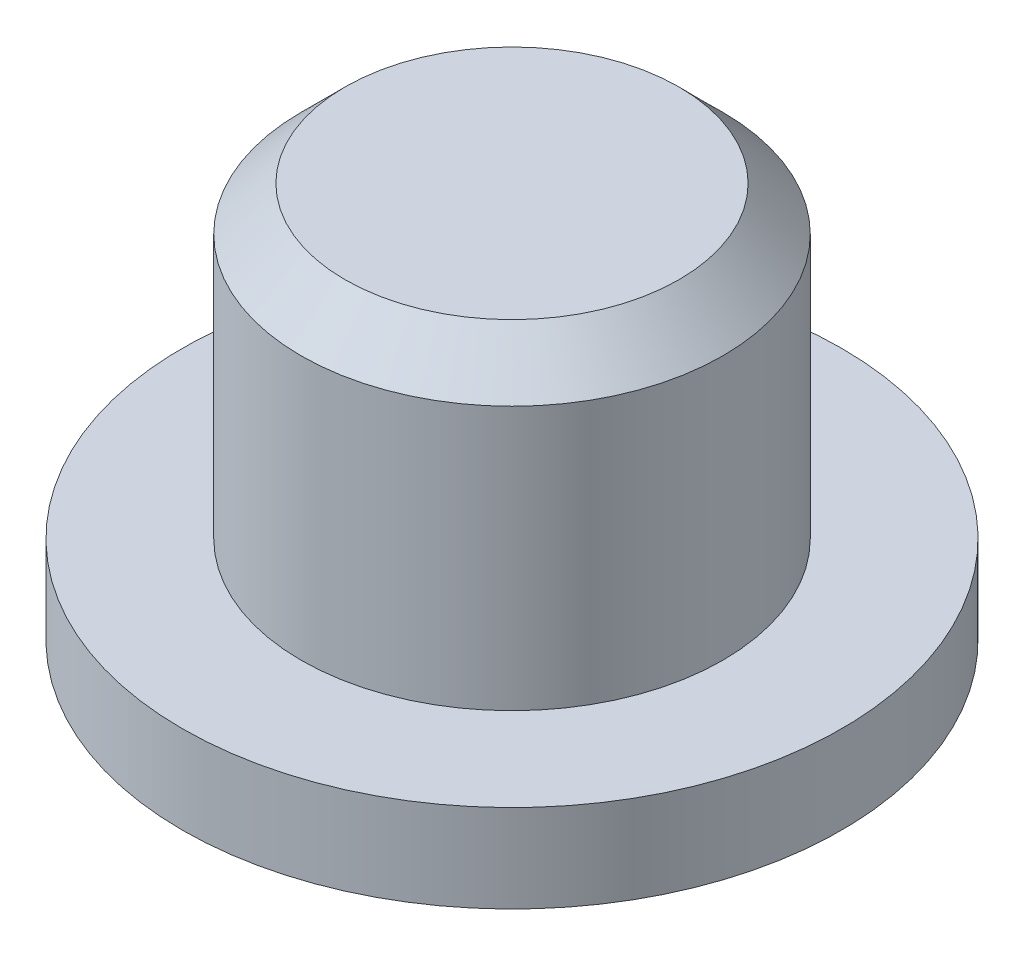
ISO-10303-21;
HEADER;
FILE_DESCRIPTION(('STEP AP214'),'2;1');
FILE_NAME('part.step','',(''),(''),'','','');
FILE_SCHEMA(('AUTOMOTIVE_DESIGN { 1 0 10303 214 1 1 1 1 }'));
ENDSEC;
DATA;
#1=APPLICATION_CONTEXT('core data for automotive mechanical design processes');
#2=APPLICATION_PROTOCOL_DEFINITION('international standard','automotive_design',2000,#1);
#3=PRODUCT_CONTEXT('',#1,'mechanical');
#4=PRODUCT('Part','Part','',(#3));
#5=PRODUCT_RELATED_PRODUCT_CATEGORY('part','',(#4));
#6=PRODUCT_DEFINITION_FORMATION('','',#4);
#7=PRODUCT_DEFINITION_CONTEXT('part definition',#1,'design');
#8=PRODUCT_DEFINITION('design','',#6,#7);
#9=PRODUCT_DEFINITION_SHAPE('','',#8);
#10=(LENGTH_UNIT() NAMED_UNIT(*) SI_UNIT(.MILLI.,.METRE.));
#11=(NAMED_UNIT(*) PLANE_ANGLE_UNIT() SI_UNIT($,.RADIAN.));
#12=(NAMED_UNIT(*) SI_UNIT($,.STERADIAN.) SOLID_ANGLE_UNIT());
#13=UNCERTAINTY_MEASURE_WITH_UNIT(LENGTH_MEASURE(1.E-05),#10,'distance_accuracy_value','');
#14=(GEOMETRIC_REPRESENTATION_CONTEXT(3) GLOBAL_UNCERTAINTY_ASSIGNED_CONTEXT((#13)) GLOBAL_UNIT_ASSIGNED_CONTEXT((#10,
#11,#12)) REPRESENTATION_CONTEXT('',''));
#15=CARTESIAN_POINT('',(0.,0.,0.));
#16=DIRECTION('',(0.,0.,1.));
#17=DIRECTION('',(1.,0.,0.));
#18=AXIS2_PLACEMENT_3D('',#15,#16,#17);
#19=CARTESIAN_POINT('',(0.,9.,0.));
#20=DIRECTION('',(0.,-1.,0.));
#21=DIRECTION('',(0.,0.,-1.));
#22=AXIS2_PLACEMENT_3D('',#19,#20,#21);
#23=CYLINDRICAL_SURFACE('',#22,4.8);
#24=CARTESIAN_POINT('',(0.,7.99999999999999,0.));
#25=DIRECTION('',(0.,1.,0.));
#26=DIRECTION('',(0.,0.,1.));
#27=AXIS2_PLACEMENT_3D('',#24,#25,#26);
#28=CIRCLE('',#27,4.8);
#29=CARTESIAN_POINT('',(0.,7.99999999999999,4.8));
#30=VERTEX_POINT('',#29);
#31=EDGE_CURVE('E10',#30,#30,#28,.F.);
#32=ORIENTED_EDGE('',*,*,#31,.T.);
#33=EDGE_LOOP('',(#32));
#34=FACE_BOUND('',#33,.T.);
#35=CARTESIAN_POINT('',(0.,2.,0.));
#36=DIRECTION('',(0.,-1.,0.));
#37=DIRECTION('',(0.,0.,-1.));
#38=AXIS2_PLACEMENT_3D('',#35,#36,#37);
#39=CIRCLE('',#38,4.8);
#40=CARTESIAN_POINT('',(0.,2.,-4.8));
#41=VERTEX_POINT('',#40);
#42=EDGE_CURVE('E53',#41,#41,#39,.T.);
#43=ORIENTED_EDGE('',*,*,#42,.F.);
#44=EDGE_LOOP('',(#43));
#45=FACE_BOUND('',#44,.T.);
#46=ADVANCED_FACE('F39',(#34,#45),#23,.T.);
#47=CARTESIAN_POINT('',(0.,9.,0.));
#48=DIRECTION('',(0.,1.,0.));
#49=DIRECTION('',(0.,0.,1.));
#50=AXIS2_PLACEMENT_3D('',#47,#48,#49);
#51=PLANE('',#50);
#52=CARTESIAN_POINT('',(0.,9.,0.));
#53=DIRECTION('',(0.,1.,0.));
#54=DIRECTION('',(0.,0.,1.));
#55=AXIS2_PLACEMENT_3D('',#52,#53,#54);
#56=CIRCLE('',#55,3.8);
#57=CARTESIAN_POINT('',(0.,9.,3.8));
#58=VERTEX_POINT('',#57);
#59=EDGE_CURVE('E48',#58,#58,#56,.T.);
#60=ORIENTED_EDGE('',*,*,#59,.T.);
#61=EDGE_LOOP('',(#60));
#62=FACE_BOUND('',#61,.T.);
#63=ADVANCED_FACE('F83',(#62),#51,.T.);
#64=CARTESIAN_POINT('',(0.,2.,0.));
#65=DIRECTION('',(0.,-1.,0.));
#66=DIRECTION('',(0.,0.,-1.));
#67=AXIS2_PLACEMENT_3D('',#64,#65,#66);
#68=CYLINDRICAL_SURFACE('',#67,7.5);
#69=CARTESIAN_POINT('',(0.,2.,0.));
#70=DIRECTION('',(0.,-1.,0.));
#71=DIRECTION('',(0.,0.,-1.));
#72=AXIS2_PLACEMENT_3D('',#69,#70,#71);
#73=CIRCLE('',#72,7.5);
#74=CARTESIAN_POINT('',(0.,2.,-7.5));
#75=VERTEX_POINT('',#74);
#76=EDGE_CURVE('E58',#75,#75,#73,.T.);
#77=ORIENTED_EDGE('',*,*,#76,.T.);
#78=EDGE_LOOP('',(#77));
#79=FACE_BOUND('',#78,.T.);
#80=CARTESIAN_POINT('',(0.,0.,0.));
#81=DIRECTION('',(0.,-1.,0.));
#82=DIRECTION('',(0.,0.,-1.));
#83=AXIS2_PLACEMENT_3D('',#80,#81,#82);
#84=CIRCLE('',#83,7.5);
#85=CARTESIAN_POINT('',(0.,0.,-7.5));
#86=VERTEX_POINT('',#85);
#87=EDGE_CURVE('E61',#86,#86,#84,.T.);
#88=ORIENTED_EDGE('',*,*,#87,.F.);
#89=EDGE_LOOP('',(#88));
#90=FACE_BOUND('',#89,.T.);
#91=ADVANCED_FACE('F69',(#79,#90),#68,.T.);
#92=CARTESIAN_POINT('',(0.,2.,0.));
#93=DIRECTION('',(0.,-1.,0.));
#94=DIRECTION('',(0.,0.,-1.));
#95=AXIS2_PLACEMENT_3D('',#92,#93,#94);
#96=PLANE('',#95);
#97=ORIENTED_EDGE('',*,*,#42,.T.);
#98=EDGE_LOOP('',(#97));
#99=FACE_BOUND('',#98,.T.);
#100=ORIENTED_EDGE('',*,*,#76,.F.);
#101=EDGE_LOOP('',(#100));
#102=FACE_BOUND('',#101,.T.);
#103=ADVANCED_FACE('F72',(#99,#102),#96,.F.);
#104=CARTESIAN_POINT('',(0.,0.,0.));
#105=DIRECTION('',(0.,1.,0.));
#106=DIRECTION('',(0.,0.,1.));
#107=AXIS2_PLACEMENT_3D('',#104,#105,#106);
#108=PLANE('',#107);
#109=ORIENTED_EDGE('',*,*,#87,.T.);
#110=EDGE_LOOP('',(#109));
#111=FACE_BOUND('',#110,.T.);
#112=ADVANCED_FACE('F74',(#111),#108,.F.);
#113=CARTESIAN_POINT('',(0.,9.,0.));
#114=DIRECTION('',(0.,-1.,0.));
#115=DIRECTION('',(0.,0.,-1.));
#116=AXIS2_PLACEMENT_3D('',#113,#114,#115);
#117=CONICAL_SURFACE('',#116,3.8,0.785398163397447);
#118=ORIENTED_EDGE('',*,*,#31,.F.);
#119=EDGE_LOOP('',(#118));
#120=FACE_BOUND('',#119,.T.);
#121=ORIENTED_EDGE('',*,*,#59,.F.);
#122=EDGE_LOOP('',(#121));
#123=FACE_BOUND('',#122,.T.);
#124=ADVANCED_FACE('F42',(#120,#123),#117,.T.);
#125=CLOSED_SHELL('',(#46,#63,#91,#103,#112,#124));
#126=MANIFOLD_SOLID_BREP('B2',#125);
#127=ADVANCED_BREP_SHAPE_REPRESENTATION('',(#18,#126),#14);
#128=SHAPE_DEFINITION_REPRESENTATION(#9,#127);
ENDSEC;
END-ISO-10303-21;
